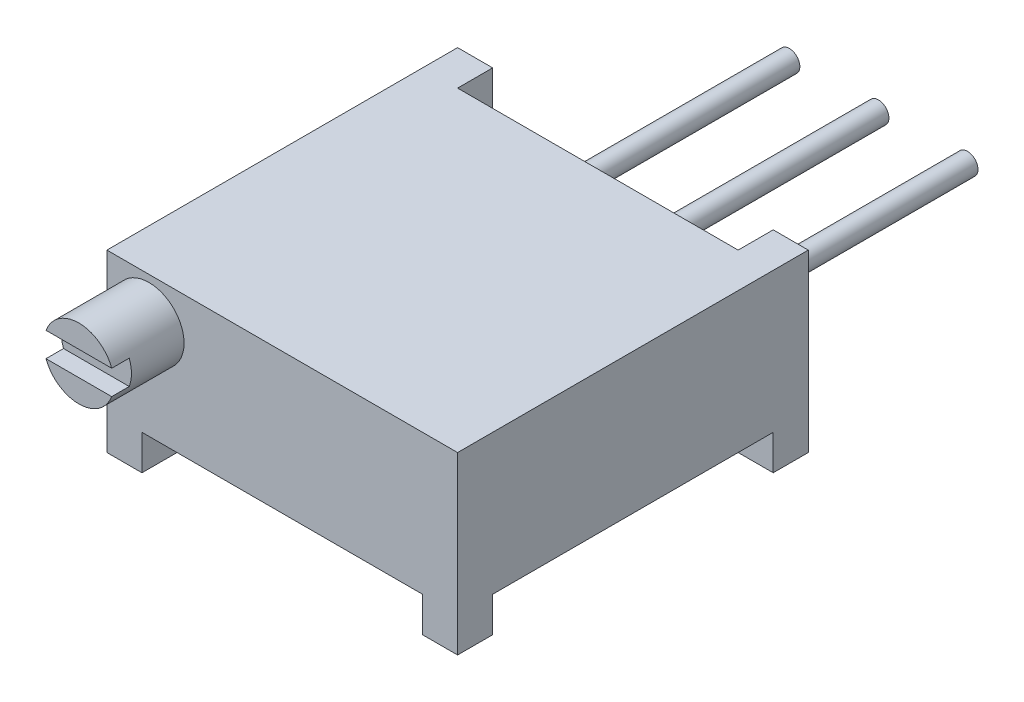
ISO-10303-21;
HEADER;
FILE_DESCRIPTION(('STEP AP214'),'2;1');
FILE_NAME('part.step','',(''),(''),'','','');
FILE_SCHEMA(('AUTOMOTIVE_DESIGN { 1 0 10303 214 1 1 1 1 }'));
ENDSEC;
DATA;
#1=APPLICATION_CONTEXT('core data for automotive mechanical design processes');
#2=APPLICATION_PROTOCOL_DEFINITION('international standard','automotive_design',2000,#1);
#3=PRODUCT_CONTEXT('',#1,'mechanical');
#4=PRODUCT('Part','Part','',(#3));
#5=PRODUCT_RELATED_PRODUCT_CATEGORY('part','',(#4));
#6=PRODUCT_DEFINITION_FORMATION('','',#4);
#7=PRODUCT_DEFINITION_CONTEXT('part definition',#1,'design');
#8=PRODUCT_DEFINITION('design','',#6,#7);
#9=PRODUCT_DEFINITION_SHAPE('','',#8);
#10=(LENGTH_UNIT() NAMED_UNIT(*) SI_UNIT(.MILLI.,.METRE.));
#11=(NAMED_UNIT(*) PLANE_ANGLE_UNIT() SI_UNIT($,.RADIAN.));
#12=(NAMED_UNIT(*) SI_UNIT($,.STERADIAN.) SOLID_ANGLE_UNIT());
#13=UNCERTAINTY_MEASURE_WITH_UNIT(LENGTH_MEASURE(1.E-05),#10,'distance_accuracy_value','');
#14=(GEOMETRIC_REPRESENTATION_CONTEXT(3) GLOBAL_UNCERTAINTY_ASSIGNED_CONTEXT((#13)) GLOBAL_UNIT_ASSIGNED_CONTEXT((#10,
#11,#12)) REPRESENTATION_CONTEXT('',''));
#15=CARTESIAN_POINT('',(0.,0.,0.));
#16=DIRECTION('',(0.,0.,1.));
#17=DIRECTION('',(1.,0.,0.));
#18=AXIS2_PLACEMENT_3D('',#15,#16,#17);
#19=CARTESIAN_POINT('',(-3.8,1.39,11.5));
#20=DIRECTION('',(0.,0.,1.));
#21=DIRECTION('',(1.,0.,0.));
#22=AXIS2_PLACEMENT_3D('',#19,#20,#21);
#23=PLANE('',#22);
#24=CARTESIAN_POINT('',(-3.8,1.39,11.5));
#25=DIRECTION('',(0.,0.,1.));
#26=DIRECTION('',(1.,0.,0.));
#27=AXIS2_PLACEMENT_3D('',#24,#25,#26);
#28=CIRCLE('',#27,1.00000000000011);
#29=CARTESIAN_POINT('',(-2.86325030024012,1.04,11.5));
#30=VERTEX_POINT('',#29);
#31=CARTESIAN_POINT('',(-2.86325030024012,1.74,11.5));
#32=VERTEX_POINT('',#31);
#33=EDGE_CURVE('E203',#30,#32,#28,.T.);
#34=ORIENTED_EDGE('',*,*,#33,.T.);
#35=DIRECTION('',(1.,0.,0.));
#36=VECTOR('',#35,1.);
#37=CARTESIAN_POINT('',(-2.86325030024012,1.74,11.5));
#38=LINE('',#37,#36);
#39=CARTESIAN_POINT('',(-4.73674969975988,1.74,11.5));
#40=VERTEX_POINT('',#39);
#41=EDGE_CURVE('E190',#40,#32,#38,.T.);
#42=ORIENTED_EDGE('',*,*,#41,.F.);
#43=CARTESIAN_POINT('',(-4.73674969975988,1.04,11.5));
#44=VERTEX_POINT('',#43);
#45=EDGE_CURVE('E196',#40,#44,#28,.T.);
#46=ORIENTED_EDGE('',*,*,#45,.T.);
#47=DIRECTION('',(1.,0.,0.));
#48=VECTOR('',#47,1.);
#49=CARTESIAN_POINT('',(-4.73674969975988,1.04,11.5));
#50=LINE('',#49,#48);
#51=EDGE_CURVE('E206',#44,#30,#50,.T.);
#52=ORIENTED_EDGE('',*,*,#51,.T.);
#53=EDGE_LOOP('',(#34,#42,#46,#52));
#54=FACE_BOUND('',#53,.T.);
#55=ADVANCED_FACE('F37',(#54),#23,.T.);
#56=CARTESIAN_POINT('',(-5.,-1.41,1.));
#57=DIRECTION('',(0.,1.,0.));
#58=DIRECTION('',(0.,0.,1.));
#59=AXIS2_PLACEMENT_3D('',#56,#57,#58);
#60=PLANE('',#59);
#61=DIRECTION('',(0.,0.,-1.));
#62=VECTOR('',#61,1.);
#63=CARTESIAN_POINT('',(4.,-1.41,9.));
#64=LINE('',#63,#62);
#65=CARTESIAN_POINT('',(4.,-1.41,10.));
#66=VERTEX_POINT('',#65);
#67=CARTESIAN_POINT('',(4.,-1.41,9.));
#68=VERTEX_POINT('',#67);
#69=EDGE_CURVE('E217',#66,#68,#64,.T.);
#70=ORIENTED_EDGE('',*,*,#69,.F.);
#71=DIRECTION('',(1.,0.,0.));
#72=VECTOR('',#71,1.);
#73=CARTESIAN_POINT('',(-5.,-1.41,10.));
#74=LINE('',#73,#72);
#75=CARTESIAN_POINT('',(-4.,-1.41,10.));
#76=VERTEX_POINT('',#75);
#77=EDGE_CURVE('E321',#76,#66,#74,.T.);
#78=ORIENTED_EDGE('',*,*,#77,.F.);
#79=DIRECTION('',(0.,0.,1.));
#80=VECTOR('',#79,1.);
#81=CARTESIAN_POINT('',(-4.,-1.41,10.));
#82=LINE('',#81,#80);
#83=CARTESIAN_POINT('',(-4.,-1.41,9.));
#84=VERTEX_POINT('',#83);
#85=EDGE_CURVE('E246',#84,#76,#82,.T.);
#86=ORIENTED_EDGE('',*,*,#85,.F.);
#87=DIRECTION('',(1.,0.,0.));
#88=VECTOR('',#87,1.);
#89=CARTESIAN_POINT('',(-4.,-1.41,9.));
#90=LINE('',#89,#88);
#91=CARTESIAN_POINT('',(-5.,-1.41,9.));
#92=VERTEX_POINT('',#91);
#93=EDGE_CURVE('E241',#92,#84,#90,.T.);
#94=ORIENTED_EDGE('',*,*,#93,.F.);
#95=DIRECTION('',(0.,0.,1.));
#96=VECTOR('',#95,1.);
#97=CARTESIAN_POINT('',(-5.,-1.41,1.));
#98=LINE('',#97,#96);
#99=CARTESIAN_POINT('',(-5.,-1.41,1.));
#100=VERTEX_POINT('',#99);
#101=EDGE_CURVE('E312',#100,#92,#98,.T.);
#102=ORIENTED_EDGE('',*,*,#101,.F.);
#103=DIRECTION('',(1.,0.,0.));
#104=VECTOR('',#103,1.);
#105=CARTESIAN_POINT('',(-5.,-1.41,1.));
#106=LINE('',#105,#104);
#107=CARTESIAN_POINT('',(-4.,-1.41,1.));
#108=VERTEX_POINT('',#107);
#109=EDGE_CURVE('E315',#100,#108,#106,.T.);
#110=ORIENTED_EDGE('',*,*,#109,.T.);
#111=DIRECTION('',(-1.,0.,0.));
#112=VECTOR('',#111,1.);
#113=CARTESIAN_POINT('',(5.,-1.41,1.));
#114=LINE('',#113,#112);
#115=CARTESIAN_POINT('',(4.,-1.41,1.));
#116=VERTEX_POINT('',#115);
#117=EDGE_CURVE('E306',#116,#108,#114,.T.);
#118=ORIENTED_EDGE('',*,*,#117,.F.);
#119=DIRECTION('',(-1.,0.,0.));
#120=VECTOR('',#119,1.);
#121=CARTESIAN_POINT('',(4.,-1.41,1.));
#122=LINE('',#121,#120);
#123=CARTESIAN_POINT('',(5.,-1.41,1.));
#124=VERTEX_POINT('',#123);
#125=EDGE_CURVE('E263',#124,#116,#122,.T.);
#126=ORIENTED_EDGE('',*,*,#125,.F.);
#127=DIRECTION('',(0.,0.,-1.));
#128=VECTOR('',#127,1.);
#129=CARTESIAN_POINT('',(5.,-1.41,1.));
#130=LINE('',#129,#128);
#131=CARTESIAN_POINT('',(5.,-1.41,9.));
#132=VERTEX_POINT('',#131);
#133=EDGE_CURVE('E300',#132,#124,#130,.T.);
#134=ORIENTED_EDGE('',*,*,#133,.F.);
#135=DIRECTION('',(1.,0.,0.));
#136=VECTOR('',#135,1.);
#137=CARTESIAN_POINT('',(5.,-1.41,9.));
#138=LINE('',#137,#136);
#139=EDGE_CURVE('E224',#68,#132,#138,.T.);
#140=ORIENTED_EDGE('',*,*,#139,.F.);
#141=EDGE_LOOP('',(#70,#78,#86,#94,#102,#110,#118,#126,#134,#140));
#142=FACE_BOUND('',#141,.T.);
#143=ADVANCED_FACE('F362',(#142),#60,.F.);
#144=CARTESIAN_POINT('',(5.,2.59,1.));
#145=DIRECTION('',(0.,0.,1.));
#146=DIRECTION('',(1.,0.,0.));
#147=AXIS2_PLACEMENT_3D('',#144,#145,#146);
#148=PLANE('',#147);
#149=CARTESIAN_POINT('',(-2.54,0.,1.));
#150=DIRECTION('',(0.,0.,1.));
#151=DIRECTION('',(1.,0.,0.));
#152=AXIS2_PLACEMENT_3D('',#149,#150,#151);
#153=CIRCLE('',#152,0.3);
#154=CARTESIAN_POINT('',(-2.24,0.,1.));
#155=VERTEX_POINT('',#154);
#156=EDGE_CURVE('E11',#155,#155,#153,.F.);
#157=ORIENTED_EDGE('',*,*,#156,.F.);
#158=EDGE_LOOP('',(#157));
#159=FACE_BOUND('',#158,.T.);
#160=CARTESIAN_POINT('',(0.,0.,1.));
#161=DIRECTION('',(0.,0.,1.));
#162=DIRECTION('',(1.,0.,0.));
#163=AXIS2_PLACEMENT_3D('',#160,#161,#162);
#164=CIRCLE('',#163,0.3);
#165=CARTESIAN_POINT('',(0.3,0.,1.));
#166=VERTEX_POINT('',#165);
#167=EDGE_CURVE('E45',#166,#166,#164,.F.);
#168=ORIENTED_EDGE('',*,*,#167,.F.);
#169=EDGE_LOOP('',(#168));
#170=FACE_BOUND('',#169,.T.);
#171=CARTESIAN_POINT('',(2.54,0.,1.));
#172=DIRECTION('',(0.,0.,1.));
#173=DIRECTION('',(1.,0.,0.));
#174=AXIS2_PLACEMENT_3D('',#171,#172,#173);
#175=CIRCLE('',#174,0.3);
#176=CARTESIAN_POINT('',(2.84,0.,1.));
#177=VERTEX_POINT('',#176);
#178=EDGE_CURVE('E347',#177,#177,#175,.F.);
#179=ORIENTED_EDGE('',*,*,#178,.F.);
#180=EDGE_LOOP('',(#179));
#181=FACE_BOUND('',#180,.T.);
#182=DIRECTION('',(0.,1.,0.));
#183=VECTOR('',#182,1.);
#184=CARTESIAN_POINT('',(4.,2.59,1.));
#185=LINE('',#184,#183);
#186=CARTESIAN_POINT('',(4.,2.59,1.));
#187=VERTEX_POINT('',#186);
#188=EDGE_CURVE('E281',#116,#187,#185,.T.);
#189=ORIENTED_EDGE('',*,*,#188,.F.);
#190=ORIENTED_EDGE('',*,*,#117,.T.);
#191=DIRECTION('',(0.,1.,0.));
#192=VECTOR('',#191,1.);
#193=CARTESIAN_POINT('',(-4.,2.59,1.));
#194=LINE('',#193,#192);
#195=CARTESIAN_POINT('',(-4.,2.59,1.));
#196=VERTEX_POINT('',#195);
#197=EDGE_CURVE('E294',#108,#196,#194,.T.);
#198=ORIENTED_EDGE('',*,*,#197,.T.);
#199=DIRECTION('',(-1.,0.,0.));
#200=VECTOR('',#199,1.);
#201=CARTESIAN_POINT('',(5.,2.59,1.));
#202=LINE('',#201,#200);
#203=EDGE_CURVE('E302',#187,#196,#202,.T.);
#204=ORIENTED_EDGE('',*,*,#203,.F.);
#205=EDGE_LOOP('',(#189,#190,#198,#204));
#206=FACE_BOUND('',#205,.T.);
#207=ADVANCED_FACE('F358',(#159,#170,#181,#206),#148,.F.);
#208=CARTESIAN_POINT('',(-4.,0.,0.));
#209=DIRECTION('',(-1.,0.,0.));
#210=DIRECTION('',(0.,0.,1.));
#211=AXIS2_PLACEMENT_3D('',#208,#209,#210);
#212=PLANE('',#211);
#213=ORIENTED_EDGE('',*,*,#197,.F.);
#214=DIRECTION('',(0.,1.,0.));
#215=VECTOR('',#214,1.);
#216=CARTESIAN_POINT('',(-4.,-2.41,1.));
#217=LINE('',#216,#215);
#218=CARTESIAN_POINT('',(-4.,-2.41,1.));
#219=VERTEX_POINT('',#218);
#220=EDGE_CURVE('E308',#219,#108,#217,.T.);
#221=ORIENTED_EDGE('',*,*,#220,.F.);
#222=DIRECTION('',(0.,0.,1.));
#223=VECTOR('',#222,1.);
#224=CARTESIAN_POINT('',(-4.,-2.41,0.));
#225=LINE('',#224,#223);
#226=CARTESIAN_POINT('',(-4.,-2.41,0.));
#227=VERTEX_POINT('',#226);
#228=EDGE_CURVE('E329',#227,#219,#225,.T.);
#229=ORIENTED_EDGE('',*,*,#228,.F.);
#230=DIRECTION('',(0.,-1.,0.));
#231=VECTOR('',#230,1.);
#232=CARTESIAN_POINT('',(-4.,2.59,0.));
#233=LINE('',#232,#231);
#234=CARTESIAN_POINT('',(-4.,2.59,0.));
#235=VERTEX_POINT('',#234);
#236=EDGE_CURVE('E326',#235,#227,#233,.T.);
#237=ORIENTED_EDGE('',*,*,#236,.F.);
#238=DIRECTION('',(0.,0.,-1.));
#239=VECTOR('',#238,1.);
#240=CARTESIAN_POINT('',(-4.,2.59,10.));
#241=LINE('',#240,#239);
#242=EDGE_CURVE('E333',#196,#235,#241,.T.);
#243=ORIENTED_EDGE('',*,*,#242,.F.);
#244=EDGE_LOOP('',(#213,#221,#229,#237,#243));
#245=FACE_BOUND('',#244,.T.);
#246=ADVANCED_FACE('F361',(#245),#212,.F.);
#247=CARTESIAN_POINT('',(-4.,2.59,0.));
#248=DIRECTION('',(0.,0.,-1.));
#249=DIRECTION('',(0.,1.,0.));
#250=AXIS2_PLACEMENT_3D('',#247,#248,#249);
#251=PLANE('',#250);
#252=DIRECTION('',(0.,-1.,0.));
#253=VECTOR('',#252,1.);
#254=CARTESIAN_POINT('',(-5.,2.59,0.));
#255=LINE('',#254,#253);
#256=CARTESIAN_POINT('',(-5.,2.59,0.));
#257=VERTEX_POINT('',#256);
#258=CARTESIAN_POINT('',(-5.,-2.41,0.));
#259=VERTEX_POINT('',#258);
#260=EDGE_CURVE('E320',#257,#259,#255,.T.);
#261=ORIENTED_EDGE('',*,*,#260,.F.);
#262=DIRECTION('',(-1.,0.,0.));
#263=VECTOR('',#262,1.);
#264=CARTESIAN_POINT('',(-4.,2.59,0.));
#265=LINE('',#264,#263);
#266=EDGE_CURVE('E345',#235,#257,#265,.T.);
#267=ORIENTED_EDGE('',*,*,#266,.F.);
#268=ORIENTED_EDGE('',*,*,#236,.T.);
#269=DIRECTION('',(-1.,0.,0.));
#270=VECTOR('',#269,1.);
#271=CARTESIAN_POINT('',(-4.,-2.41,0.));
#272=LINE('',#271,#270);
#273=EDGE_CURVE('E335',#227,#259,#272,.T.);
#274=ORIENTED_EDGE('',*,*,#273,.T.);
#275=EDGE_LOOP('',(#261,#267,#268,#274));
#276=FACE_BOUND('',#275,.T.);
#277=ADVANCED_FACE('F39',(#276),#251,.T.);
#278=CARTESIAN_POINT('',(-4.,2.59,10.));
#279=DIRECTION('',(0.,1.,0.));
#280=DIRECTION('',(0.,0.,1.));
#281=AXIS2_PLACEMENT_3D('',#278,#279,#280);
#282=PLANE('',#281);
#283=DIRECTION('',(0.,0.,-1.));
#284=VECTOR('',#283,1.);
#285=CARTESIAN_POINT('',(-5.,2.59,10.));
#286=LINE('',#285,#284);
#287=CARTESIAN_POINT('',(-5.,2.59,10.));
#288=VERTEX_POINT('',#287);
#289=EDGE_CURVE('E330',#288,#257,#286,.T.);
#290=ORIENTED_EDGE('',*,*,#289,.F.);
#291=DIRECTION('',(-1.,0.,0.));
#292=VECTOR('',#291,1.);
#293=CARTESIAN_POINT('',(-4.,2.59,10.));
#294=LINE('',#293,#292);
#295=CARTESIAN_POINT('',(5.,2.59,10.));
#296=VERTEX_POINT('',#295);
#297=EDGE_CURVE('E348',#296,#288,#294,.T.);
#298=ORIENTED_EDGE('',*,*,#297,.F.);
#299=DIRECTION('',(0.,0.,1.));
#300=VECTOR('',#299,1.);
#301=CARTESIAN_POINT('',(5.,2.59,10.));
#302=LINE('',#301,#300);
#303=CARTESIAN_POINT('',(5.,2.59,0.));
#304=VERTEX_POINT('',#303);
#305=EDGE_CURVE('E295',#304,#296,#302,.T.);
#306=ORIENTED_EDGE('',*,*,#305,.F.);
#307=DIRECTION('',(1.,0.,0.));
#308=VECTOR('',#307,1.);
#309=CARTESIAN_POINT('',(5.,2.59,0.));
#310=LINE('',#309,#308);
#311=CARTESIAN_POINT('',(4.,2.59,0.));
#312=VERTEX_POINT('',#311);
#313=EDGE_CURVE('E285',#312,#304,#310,.T.);
#314=ORIENTED_EDGE('',*,*,#313,.F.);
#315=DIRECTION('',(0.,0.,1.));
#316=VECTOR('',#315,1.);
#317=CARTESIAN_POINT('',(4.,2.59,0.));
#318=LINE('',#317,#316);
#319=EDGE_CURVE('E290',#312,#187,#318,.T.);
#320=ORIENTED_EDGE('',*,*,#319,.T.);
#321=ORIENTED_EDGE('',*,*,#203,.T.);
#322=ORIENTED_EDGE('',*,*,#242,.T.);
#323=ORIENTED_EDGE('',*,*,#266,.T.);
#324=EDGE_LOOP('',(#290,#298,#306,#314,#320,#321,#322,#323));
#325=FACE_BOUND('',#324,.T.);
#326=ADVANCED_FACE('F395',(#325),#282,.T.);
#327=CARTESIAN_POINT('',(-4.,-2.41,10.));
#328=DIRECTION('',(0.,0.,1.));
#329=DIRECTION('',(1.,0.,0.));
#330=AXIS2_PLACEMENT_3D('',#327,#328,#329);
#331=PLANE('',#330);
#332=CARTESIAN_POINT('',(-3.8,1.39,10.));
#333=DIRECTION('',(0.,0.,1.));
#334=DIRECTION('',(1.,0.,0.));
#335=AXIS2_PLACEMENT_3D('',#332,#333,#334);
#336=CIRCLE('',#335,1.);
#337=CARTESIAN_POINT('',(-2.8,1.39,10.));
#338=VERTEX_POINT('',#337);
#339=EDGE_CURVE('E212',#338,#338,#336,.T.);
#340=ORIENTED_EDGE('',*,*,#339,.F.);
#341=EDGE_LOOP('',(#340));
#342=FACE_BOUND('',#341,.T.);
#343=DIRECTION('',(0.,1.,0.));
#344=VECTOR('',#343,1.);
#345=CARTESIAN_POINT('',(-5.,-2.41,10.));
#346=LINE('',#345,#344);
#347=CARTESIAN_POINT('',(-5.,-2.41,10.));
#348=VERTEX_POINT('',#347);
#349=EDGE_CURVE('E341',#348,#288,#346,.T.);
#350=ORIENTED_EDGE('',*,*,#349,.F.);
#351=DIRECTION('',(-1.,0.,0.));
#352=VECTOR('',#351,1.);
#353=CARTESIAN_POINT('',(-5.,-2.41,10.));
#354=LINE('',#353,#352);
#355=CARTESIAN_POINT('',(-4.,-2.41,10.));
#356=VERTEX_POINT('',#355);
#357=EDGE_CURVE('E250',#356,#348,#354,.T.);
#358=ORIENTED_EDGE('',*,*,#357,.F.);
#359=DIRECTION('',(0.,1.,0.));
#360=VECTOR('',#359,1.);
#361=CARTESIAN_POINT('',(-4.,-2.41,10.));
#362=LINE('',#361,#360);
#363=EDGE_CURVE('E253',#356,#76,#362,.T.);
#364=ORIENTED_EDGE('',*,*,#363,.T.);
#365=ORIENTED_EDGE('',*,*,#77,.T.);
#366=DIRECTION('',(0.,1.,0.));
#367=VECTOR('',#366,1.);
#368=CARTESIAN_POINT('',(4.,-2.41,10.));
#369=LINE('',#368,#367);
#370=CARTESIAN_POINT('',(4.,-2.41,10.));
#371=VERTEX_POINT('',#370);
#372=EDGE_CURVE('E231',#371,#66,#369,.T.);
#373=ORIENTED_EDGE('',*,*,#372,.F.);
#374=DIRECTION('',(-1.,0.,0.));
#375=VECTOR('',#374,1.);
#376=CARTESIAN_POINT('',(4.,-2.41,10.));
#377=LINE('',#376,#375);
#378=CARTESIAN_POINT('',(5.,-2.41,10.));
#379=VERTEX_POINT('',#378);
#380=EDGE_CURVE('E229',#379,#371,#377,.T.);
#381=ORIENTED_EDGE('',*,*,#380,.F.);
#382=DIRECTION('',(0.,-1.,0.));
#383=VECTOR('',#382,1.);
#384=CARTESIAN_POINT('',(5.,-1.41,10.));
#385=LINE('',#384,#383);
#386=EDGE_CURVE('E298',#296,#379,#385,.T.);
#387=ORIENTED_EDGE('',*,*,#386,.F.);
#388=ORIENTED_EDGE('',*,*,#297,.T.);
#389=EDGE_LOOP('',(#350,#358,#364,#365,#373,#381,#387,#388));
#390=FACE_BOUND('',#389,.T.);
#391=ADVANCED_FACE('F425',(#342,#390),#331,.T.);
#392=CARTESIAN_POINT('',(-4.,-2.41,0.));
#393=DIRECTION('',(0.,-1.,0.));
#394=DIRECTION('',(0.,0.,-1.));
#395=AXIS2_PLACEMENT_3D('',#392,#393,#394);
#396=PLANE('',#395);
#397=DIRECTION('',(1.,0.,0.));
#398=VECTOR('',#397,1.);
#399=CARTESIAN_POINT('',(-5.,-2.41,1.));
#400=LINE('',#399,#398);
#401=CARTESIAN_POINT('',(-5.,-2.41,1.));
#402=VERTEX_POINT('',#401);
#403=EDGE_CURVE('E318',#402,#219,#400,.T.);
#404=ORIENTED_EDGE('',*,*,#403,.F.);
#405=DIRECTION('',(0.,0.,1.));
#406=VECTOR('',#405,1.);
#407=CARTESIAN_POINT('',(-5.,-2.41,0.));
#408=LINE('',#407,#406);
#409=EDGE_CURVE('E338',#259,#402,#408,.T.);
#410=ORIENTED_EDGE('',*,*,#409,.F.);
#411=ORIENTED_EDGE('',*,*,#273,.F.);
#412=ORIENTED_EDGE('',*,*,#228,.T.);
#413=EDGE_LOOP('',(#404,#410,#411,#412));
#414=FACE_BOUND('',#413,.T.);
#415=ADVANCED_FACE('F388',(#414),#396,.T.);
#416=CARTESIAN_POINT('',(-5.,0.,0.));
#417=DIRECTION('',(-1.,0.,0.));
#418=DIRECTION('',(0.,0.,1.));
#419=AXIS2_PLACEMENT_3D('',#416,#417,#418);
#420=PLANE('',#419);
#421=DIRECTION('',(0.,1.,0.));
#422=VECTOR('',#421,1.);
#423=CARTESIAN_POINT('',(-5.,-2.41,1.));
#424=LINE('',#423,#422);
#425=EDGE_CURVE('E309',#402,#100,#424,.T.);
#426=ORIENTED_EDGE('',*,*,#425,.T.);
#427=ORIENTED_EDGE('',*,*,#101,.T.);
#428=DIRECTION('',(0.,1.,0.));
#429=VECTOR('',#428,1.);
#430=CARTESIAN_POINT('',(-5.,-2.41,9.));
#431=LINE('',#430,#429);
#432=CARTESIAN_POINT('',(-5.,-2.41,9.));
#433=VERTEX_POINT('',#432);
#434=EDGE_CURVE('E261',#433,#92,#431,.T.);
#435=ORIENTED_EDGE('',*,*,#434,.F.);
#436=DIRECTION('',(0.,0.,-1.));
#437=VECTOR('',#436,1.);
#438=CARTESIAN_POINT('',(-5.,-2.41,9.));
#439=LINE('',#438,#437);
#440=EDGE_CURVE('E242',#348,#433,#439,.T.);
#441=ORIENTED_EDGE('',*,*,#440,.F.);
#442=ORIENTED_EDGE('',*,*,#349,.T.);
#443=ORIENTED_EDGE('',*,*,#289,.T.);
#444=ORIENTED_EDGE('',*,*,#260,.T.);
#445=ORIENTED_EDGE('',*,*,#409,.T.);
#446=EDGE_LOOP('',(#426,#427,#435,#441,#442,#443,#444,#445));
#447=FACE_BOUND('',#446,.T.);
#448=ADVANCED_FACE('F439',(#447),#420,.T.);
#449=CARTESIAN_POINT('',(-5.,-2.41,1.));
#450=DIRECTION('',(0.,0.,-1.));
#451=DIRECTION('',(0.,1.,0.));
#452=AXIS2_PLACEMENT_3D('',#449,#450,#451);
#453=PLANE('',#452);
#454=ORIENTED_EDGE('',*,*,#220,.T.);
#455=ORIENTED_EDGE('',*,*,#109,.F.);
#456=ORIENTED_EDGE('',*,*,#425,.F.);
#457=ORIENTED_EDGE('',*,*,#403,.T.);
#458=EDGE_LOOP('',(#454,#455,#456,#457));
#459=FACE_BOUND('',#458,.T.);
#460=ADVANCED_FACE('F381',(#459),#453,.F.);
#461=CARTESIAN_POINT('',(5.,0.,0.));
#462=DIRECTION('',(-1.,0.,0.));
#463=DIRECTION('',(0.,0.,1.));
#464=AXIS2_PLACEMENT_3D('',#461,#462,#463);
#465=PLANE('',#464);
#466=ORIENTED_EDGE('',*,*,#305,.T.);
#467=ORIENTED_EDGE('',*,*,#386,.T.);
#468=DIRECTION('',(0.,0.,1.));
#469=VECTOR('',#468,1.);
#470=CARTESIAN_POINT('',(5.,-2.41,10.));
#471=LINE('',#470,#469);
#472=CARTESIAN_POINT('',(5.,-2.41,9.));
#473=VERTEX_POINT('',#472);
#474=EDGE_CURVE('E226',#473,#379,#471,.T.);
#475=ORIENTED_EDGE('',*,*,#474,.F.);
#476=DIRECTION('',(0.,1.,0.));
#477=VECTOR('',#476,1.);
#478=CARTESIAN_POINT('',(5.,-2.41,9.));
#479=LINE('',#478,#477);
#480=EDGE_CURVE('E237',#473,#132,#479,.T.);
#481=ORIENTED_EDGE('',*,*,#480,.T.);
#482=ORIENTED_EDGE('',*,*,#133,.T.);
#483=DIRECTION('',(0.,1.,0.));
#484=VECTOR('',#483,1.);
#485=CARTESIAN_POINT('',(5.,-2.41,1.));
#486=LINE('',#485,#484);
#487=CARTESIAN_POINT('',(5.,-2.41,1.));
#488=VERTEX_POINT('',#487);
#489=EDGE_CURVE('E278',#488,#124,#486,.T.);
#490=ORIENTED_EDGE('',*,*,#489,.F.);
#491=DIRECTION('',(0.,0.,1.));
#492=VECTOR('',#491,1.);
#493=CARTESIAN_POINT('',(5.,-2.41,1.));
#494=LINE('',#493,#492);
#495=CARTESIAN_POINT('',(5.,-2.41,0.));
#496=VERTEX_POINT('',#495);
#497=EDGE_CURVE('E270',#496,#488,#494,.T.);
#498=ORIENTED_EDGE('',*,*,#497,.F.);
#499=DIRECTION('',(0.,-1.,0.));
#500=VECTOR('',#499,1.);
#501=CARTESIAN_POINT('',(5.,-1.41,0.));
#502=LINE('',#501,#500);
#503=EDGE_CURVE('E288',#304,#496,#502,.T.);
#504=ORIENTED_EDGE('',*,*,#503,.F.);
#505=EDGE_LOOP('',(#466,#467,#475,#481,#482,#490,#498,#504));
#506=FACE_BOUND('',#505,.T.);
#507=ADVANCED_FACE('F411',(#506),#465,.F.);
#508=CARTESIAN_POINT('',(4.,2.59,0.));
#509=DIRECTION('',(1.,0.,0.));
#510=DIRECTION('',(0.,0.,-1.));
#511=AXIS2_PLACEMENT_3D('',#508,#509,#510);
#512=PLANE('',#511);
#513=ORIENTED_EDGE('',*,*,#188,.T.);
#514=ORIENTED_EDGE('',*,*,#319,.F.);
#515=DIRECTION('',(0.,1.,0.));
#516=VECTOR('',#515,1.);
#517=CARTESIAN_POINT('',(4.,2.59,0.));
#518=LINE('',#517,#516);
#519=CARTESIAN_POINT('',(4.,-2.41,0.));
#520=VERTEX_POINT('',#519);
#521=EDGE_CURVE('E282',#520,#312,#518,.T.);
#522=ORIENTED_EDGE('',*,*,#521,.F.);
#523=DIRECTION('',(0.,0.,-1.));
#524=VECTOR('',#523,1.);
#525=CARTESIAN_POINT('',(4.,-2.41,0.));
#526=LINE('',#525,#524);
#527=CARTESIAN_POINT('',(4.,-2.41,1.));
#528=VERTEX_POINT('',#527);
#529=EDGE_CURVE('E264',#528,#520,#526,.T.);
#530=ORIENTED_EDGE('',*,*,#529,.F.);
#531=DIRECTION('',(0.,1.,0.));
#532=VECTOR('',#531,1.);
#533=CARTESIAN_POINT('',(4.,-2.41,1.));
#534=LINE('',#533,#532);
#535=EDGE_CURVE('E274',#528,#116,#534,.T.);
#536=ORIENTED_EDGE('',*,*,#535,.T.);
#537=EDGE_LOOP('',(#513,#514,#522,#530,#536));
#538=FACE_BOUND('',#537,.T.);
#539=ADVANCED_FACE('F396',(#538),#512,.F.);
#540=CARTESIAN_POINT('',(0.,0.,0.));
#541=DIRECTION('',(0.,0.,1.));
#542=DIRECTION('',(1.,0.,0.));
#543=AXIS2_PLACEMENT_3D('',#540,#541,#542);
#544=PLANE('',#543);
#545=ORIENTED_EDGE('',*,*,#521,.T.);
#546=ORIENTED_EDGE('',*,*,#313,.T.);
#547=ORIENTED_EDGE('',*,*,#503,.T.);
#548=DIRECTION('',(1.,0.,0.));
#549=VECTOR('',#548,1.);
#550=CARTESIAN_POINT('',(5.,-2.41,0.));
#551=LINE('',#550,#549);
#552=EDGE_CURVE('E267',#520,#496,#551,.T.);
#553=ORIENTED_EDGE('',*,*,#552,.F.);
#554=EDGE_LOOP('',(#545,#546,#547,#553));
#555=FACE_BOUND('',#554,.T.);
#556=ADVANCED_FACE('F400',(#555),#544,.F.);
#557=CARTESIAN_POINT('',(4.,-2.41,1.));
#558=DIRECTION('',(0.,0.,-1.));
#559=DIRECTION('',(-1.,0.,0.));
#560=AXIS2_PLACEMENT_3D('',#557,#558,#559);
#561=PLANE('',#560);
#562=ORIENTED_EDGE('',*,*,#125,.T.);
#563=ORIENTED_EDGE('',*,*,#535,.F.);
#564=DIRECTION('',(-1.,0.,0.));
#565=VECTOR('',#564,1.);
#566=CARTESIAN_POINT('',(4.,-2.41,1.));
#567=LINE('',#566,#565);
#568=EDGE_CURVE('E272',#488,#528,#567,.T.);
#569=ORIENTED_EDGE('',*,*,#568,.F.);
#570=ORIENTED_EDGE('',*,*,#489,.T.);
#571=EDGE_LOOP('',(#562,#563,#569,#570));
#572=FACE_BOUND('',#571,.T.);
#573=ADVANCED_FACE('F409',(#572),#561,.F.);
#574=CARTESIAN_POINT('',(0.,-2.41,0.));
#575=DIRECTION('',(0.,1.,0.));
#576=DIRECTION('',(0.,0.,1.));
#577=AXIS2_PLACEMENT_3D('',#574,#575,#576);
#578=PLANE('',#577);
#579=ORIENTED_EDGE('',*,*,#529,.T.);
#580=ORIENTED_EDGE('',*,*,#552,.T.);
#581=ORIENTED_EDGE('',*,*,#497,.T.);
#582=ORIENTED_EDGE('',*,*,#568,.T.);
#583=EDGE_LOOP('',(#579,#580,#581,#582));
#584=FACE_BOUND('',#583,.T.);
#585=ADVANCED_FACE('F404',(#584),#578,.F.);
#586=CARTESIAN_POINT('',(-4.,-2.41,9.));
#587=DIRECTION('',(0.,0.,1.));
#588=DIRECTION('',(1.,0.,0.));
#589=AXIS2_PLACEMENT_3D('',#586,#587,#588);
#590=PLANE('',#589);
#591=ORIENTED_EDGE('',*,*,#93,.T.);
#592=DIRECTION('',(0.,1.,0.));
#593=VECTOR('',#592,1.);
#594=CARTESIAN_POINT('',(-4.,-2.41,9.));
#595=LINE('',#594,#593);
#596=CARTESIAN_POINT('',(-4.,-2.41,9.));
#597=VERTEX_POINT('',#596);
#598=EDGE_CURVE('E258',#597,#84,#595,.T.);
#599=ORIENTED_EDGE('',*,*,#598,.F.);
#600=DIRECTION('',(1.,0.,0.));
#601=VECTOR('',#600,1.);
#602=CARTESIAN_POINT('',(-4.,-2.41,9.));
#603=LINE('',#602,#601);
#604=EDGE_CURVE('E245',#433,#597,#603,.T.);
#605=ORIENTED_EDGE('',*,*,#604,.F.);
#606=ORIENTED_EDGE('',*,*,#434,.T.);
#607=EDGE_LOOP('',(#591,#599,#605,#606));
#608=FACE_BOUND('',#607,.T.);
#609=ADVANCED_FACE('F435',(#608),#590,.F.);
#610=CARTESIAN_POINT('',(-4.,-2.41,10.));
#611=DIRECTION('',(-1.,0.,0.));
#612=DIRECTION('',(0.,0.,1.));
#613=AXIS2_PLACEMENT_3D('',#610,#611,#612);
#614=PLANE('',#613);
#615=ORIENTED_EDGE('',*,*,#85,.T.);
#616=ORIENTED_EDGE('',*,*,#363,.F.);
#617=DIRECTION('',(0.,0.,1.));
#618=VECTOR('',#617,1.);
#619=CARTESIAN_POINT('',(-4.,-2.41,10.));
#620=LINE('',#619,#618);
#621=EDGE_CURVE('E248',#597,#356,#620,.T.);
#622=ORIENTED_EDGE('',*,*,#621,.F.);
#623=ORIENTED_EDGE('',*,*,#598,.T.);
#624=EDGE_LOOP('',(#615,#616,#622,#623));
#625=FACE_BOUND('',#624,.T.);
#626=ADVANCED_FACE('F431',(#625),#614,.F.);
#627=CARTESIAN_POINT('',(0.,-2.41,0.));
#628=DIRECTION('',(0.,1.,0.));
#629=DIRECTION('',(0.,0.,1.));
#630=AXIS2_PLACEMENT_3D('',#627,#628,#629);
#631=PLANE('',#630);
#632=ORIENTED_EDGE('',*,*,#440,.T.);
#633=ORIENTED_EDGE('',*,*,#604,.T.);
#634=ORIENTED_EDGE('',*,*,#621,.T.);
#635=ORIENTED_EDGE('',*,*,#357,.T.);
#636=EDGE_LOOP('',(#632,#633,#634,#635));
#637=FACE_BOUND('',#636,.T.);
#638=ADVANCED_FACE('F684',(#637),#631,.F.);
#639=CARTESIAN_POINT('',(4.,-2.41,9.));
#640=DIRECTION('',(1.,0.,0.));
#641=DIRECTION('',(0.,0.,-1.));
#642=AXIS2_PLACEMENT_3D('',#639,#640,#641);
#643=PLANE('',#642);
#644=ORIENTED_EDGE('',*,*,#69,.T.);
#645=DIRECTION('',(0.,1.,0.));
#646=VECTOR('',#645,1.);
#647=CARTESIAN_POINT('',(4.,-2.41,9.));
#648=LINE('',#647,#646);
#649=CARTESIAN_POINT('',(4.,-2.41,9.));
#650=VERTEX_POINT('',#649);
#651=EDGE_CURVE('E239',#650,#68,#648,.T.);
#652=ORIENTED_EDGE('',*,*,#651,.F.);
#653=DIRECTION('',(0.,0.,-1.));
#654=VECTOR('',#653,1.);
#655=CARTESIAN_POINT('',(4.,-2.41,9.));
#656=LINE('',#655,#654);
#657=EDGE_CURVE('E220',#371,#650,#656,.T.);
#658=ORIENTED_EDGE('',*,*,#657,.F.);
#659=ORIENTED_EDGE('',*,*,#372,.T.);
#660=EDGE_LOOP('',(#644,#652,#658,#659));
#661=FACE_BOUND('',#660,.T.);
#662=ADVANCED_FACE('F421',(#661),#643,.F.);
#663=CARTESIAN_POINT('',(5.,-2.41,9.));
#664=DIRECTION('',(0.,0.,1.));
#665=DIRECTION('',(1.,0.,0.));
#666=AXIS2_PLACEMENT_3D('',#663,#664,#665);
#667=PLANE('',#666);
#668=ORIENTED_EDGE('',*,*,#139,.T.);
#669=ORIENTED_EDGE('',*,*,#480,.F.);
#670=DIRECTION('',(1.,0.,0.));
#671=VECTOR('',#670,1.);
#672=CARTESIAN_POINT('',(5.,-2.41,9.));
#673=LINE('',#672,#671);
#674=EDGE_CURVE('E223',#650,#473,#673,.T.);
#675=ORIENTED_EDGE('',*,*,#674,.F.);
#676=ORIENTED_EDGE('',*,*,#651,.T.);
#677=EDGE_LOOP('',(#668,#669,#675,#676));
#678=FACE_BOUND('',#677,.T.);
#679=ADVANCED_FACE('F417',(#678),#667,.F.);
#680=CARTESIAN_POINT('',(0.,-2.41,0.));
#681=DIRECTION('',(0.,1.,0.));
#682=DIRECTION('',(0.,0.,1.));
#683=AXIS2_PLACEMENT_3D('',#680,#681,#682);
#684=PLANE('',#683);
#685=ORIENTED_EDGE('',*,*,#657,.T.);
#686=ORIENTED_EDGE('',*,*,#674,.T.);
#687=ORIENTED_EDGE('',*,*,#474,.T.);
#688=ORIENTED_EDGE('',*,*,#380,.T.);
#689=EDGE_LOOP('',(#685,#686,#687,#688));
#690=FACE_BOUND('',#689,.T.);
#691=ADVANCED_FACE('F441',(#690),#684,.F.);
#692=CARTESIAN_POINT('',(-3.8,1.39,12.));
#693=DIRECTION('',(0.,0.,-1.));
#694=DIRECTION('',(-1.,0.,0.));
#695=AXIS2_PLACEMENT_3D('',#692,#693,#694);
#696=CYLINDRICAL_SURFACE('',#695,1.);
#697=CARTESIAN_POINT('',(-3.8,1.39,12.));
#698=DIRECTION('',(0.,0.,1.));
#699=DIRECTION('',(1.,0.,0.));
#700=AXIS2_PLACEMENT_3D('',#697,#698,#699);
#701=CIRCLE('',#700,1.);
#702=CARTESIAN_POINT('',(-4.73674969975976,1.04,12.));
#703=VERTEX_POINT('',#702);
#704=CARTESIAN_POINT('',(-2.86325030024012,1.04,12.));
#705=VERTEX_POINT('',#704);
#706=EDGE_CURVE('E214',#703,#705,#701,.T.);
#707=ORIENTED_EDGE('',*,*,#706,.F.);
#708=DIRECTION('',(0.,0.,1.));
#709=VECTOR('',#708,1.);
#710=CARTESIAN_POINT('',(-4.73674969975988,1.04,11.5));
#711=LINE('',#710,#709);
#712=EDGE_CURVE('E60',#44,#703,#711,.T.);
#713=ORIENTED_EDGE('',*,*,#712,.F.);
#714=ORIENTED_EDGE('',*,*,#45,.F.);
#715=DIRECTION('',(0.,0.,-1.));
#716=VECTOR('',#715,1.);
#717=CARTESIAN_POINT('',(-4.73674969975988,1.74,12.));
#718=LINE('',#717,#716);
#719=CARTESIAN_POINT('',(-4.73674969975988,1.74,12.));
#720=VERTEX_POINT('',#719);
#721=EDGE_CURVE('E52',#720,#40,#718,.T.);
#722=ORIENTED_EDGE('',*,*,#721,.F.);
#723=CARTESIAN_POINT('',(-3.8,1.39,12.));
#724=DIRECTION('',(0.,0.,1.));
#725=DIRECTION('',(-1.,0.,0.));
#726=AXIS2_PLACEMENT_3D('',#723,#724,#725);
#727=CIRCLE('',#726,1.00000000000011);
#728=CARTESIAN_POINT('',(-2.86325030024012,1.74,12.));
#729=VERTEX_POINT('',#728);
#730=EDGE_CURVE('E186',#729,#720,#727,.T.);
#731=ORIENTED_EDGE('',*,*,#730,.F.);
#732=DIRECTION('',(0.,0.,-1.));
#733=VECTOR('',#732,1.);
#734=CARTESIAN_POINT('',(-2.86325030024012,1.74,12.));
#735=LINE('',#734,#733);
#736=EDGE_CURVE('E183',#729,#32,#735,.T.);
#737=ORIENTED_EDGE('',*,*,#736,.T.);
#738=ORIENTED_EDGE('',*,*,#33,.F.);
#739=DIRECTION('',(0.,0.,1.));
#740=VECTOR('',#739,1.);
#741=CARTESIAN_POINT('',(-2.86325030024012,1.04,11.5));
#742=LINE('',#741,#740);
#743=EDGE_CURVE('E209',#30,#705,#742,.T.);
#744=ORIENTED_EDGE('',*,*,#743,.T.);
#745=EDGE_LOOP('',(#707,#713,#714,#722,#731,#737,#738,#744));
#746=FACE_BOUND('',#745,.T.);
#747=ORIENTED_EDGE('',*,*,#339,.T.);
#748=EDGE_LOOP('',(#747));
#749=FACE_BOUND('',#748,.T.);
#750=ADVANCED_FACE('F194',(#746,#749),#696,.T.);
#751=CARTESIAN_POINT('',(-3.8,1.39,12.));
#752=DIRECTION('',(0.,0.,1.));
#753=DIRECTION('',(1.,0.,0.));
#754=AXIS2_PLACEMENT_3D('',#751,#752,#753);
#755=PLANE('',#754);
#756=DIRECTION('',(1.,0.,0.));
#757=VECTOR('',#756,1.);
#758=CARTESIAN_POINT('',(-4.73674969975988,1.04,12.));
#759=LINE('',#758,#757);
#760=EDGE_CURVE('E197',#703,#705,#759,.T.);
#761=ORIENTED_EDGE('',*,*,#760,.F.);
#762=ORIENTED_EDGE('',*,*,#706,.T.);
#763=EDGE_LOOP('',(#761,#762));
#764=FACE_BOUND('',#763,.T.);
#765=ADVANCED_FACE('F448',(#764),#755,.T.);
#766=CARTESIAN_POINT('',(-4.73674969975988,1.04,11.5));
#767=DIRECTION('',(0.,-1.,0.));
#768=DIRECTION('',(0.,0.,-1.));
#769=AXIS2_PLACEMENT_3D('',#766,#767,#768);
#770=PLANE('',#769);
#771=ORIENTED_EDGE('',*,*,#760,.T.);
#772=ORIENTED_EDGE('',*,*,#743,.F.);
#773=ORIENTED_EDGE('',*,*,#51,.F.);
#774=ORIENTED_EDGE('',*,*,#712,.T.);
#775=EDGE_LOOP('',(#771,#772,#773,#774));
#776=FACE_BOUND('',#775,.T.);
#777=ADVANCED_FACE('F461',(#776),#770,.F.);
#778=CARTESIAN_POINT('',(-2.86325030024012,1.74,12.));
#779=DIRECTION('',(0.,1.,0.));
#780=DIRECTION('',(0.,0.,1.));
#781=AXIS2_PLACEMENT_3D('',#778,#779,#780);
#782=PLANE('',#781);
#783=ORIENTED_EDGE('',*,*,#41,.T.);
#784=ORIENTED_EDGE('',*,*,#736,.F.);
#785=DIRECTION('',(1.,0.,0.));
#786=VECTOR('',#785,1.);
#787=CARTESIAN_POINT('',(-2.86325030024012,1.74,12.));
#788=LINE('',#787,#786);
#789=EDGE_CURVE('E179',#720,#729,#788,.T.);
#790=ORIENTED_EDGE('',*,*,#789,.F.);
#791=ORIENTED_EDGE('',*,*,#721,.T.);
#792=EDGE_LOOP('',(#783,#784,#790,#791));
#793=FACE_BOUND('',#792,.T.);
#794=ADVANCED_FACE('F181',(#793),#782,.F.);
#795=CARTESIAN_POINT('',(-3.8,1.39,12.));
#796=DIRECTION('',(0.,0.,-1.));
#797=DIRECTION('',(-1.,0.,0.));
#798=AXIS2_PLACEMENT_3D('',#795,#796,#797);
#799=PLANE('',#798);
#800=ORIENTED_EDGE('',*,*,#730,.T.);
#801=ORIENTED_EDGE('',*,*,#789,.T.);
#802=EDGE_LOOP('',(#800,#801));
#803=FACE_BOUND('',#802,.T.);
#804=ADVANCED_FACE('F188',(#803),#799,.F.);
#805=CARTESIAN_POINT('',(2.54,0.,-7.));
#806=DIRECTION('',(0.,0.,1.));
#807=DIRECTION('',(1.,0.,0.));
#808=AXIS2_PLACEMENT_3D('',#805,#806,#807);
#809=CYLINDRICAL_SURFACE('',#808,0.3);
#810=CARTESIAN_POINT('',(2.54,0.,-7.));
#811=DIRECTION('',(0.,0.,-1.));
#812=DIRECTION('',(-1.,0.,0.));
#813=AXIS2_PLACEMENT_3D('',#810,#811,#812);
#814=CIRCLE('',#813,0.3);
#815=CARTESIAN_POINT('',(2.24,0.,-7.));
#816=VERTEX_POINT('',#815);
#817=EDGE_CURVE('E469',#816,#816,#814,.T.);
#818=ORIENTED_EDGE('',*,*,#817,.F.);
#819=EDGE_LOOP('',(#818));
#820=FACE_BOUND('',#819,.T.);
#821=ORIENTED_EDGE('',*,*,#178,.T.);
#822=EDGE_LOOP('',(#821));
#823=FACE_BOUND('',#822,.T.);
#824=ADVANCED_FACE('F502',(#820,#823),#809,.T.);
#825=CARTESIAN_POINT('',(2.54,0.,-7.));
#826=DIRECTION('',(0.,0.,-1.));
#827=DIRECTION('',(-1.,0.,0.));
#828=AXIS2_PLACEMENT_3D('',#825,#826,#827);
#829=PLANE('',#828);
#830=ORIENTED_EDGE('',*,*,#817,.T.);
#831=EDGE_LOOP('',(#830));
#832=FACE_BOUND('',#831,.T.);
#833=ADVANCED_FACE('F498',(#832),#829,.T.);
#834=CARTESIAN_POINT('',(0.,0.,-7.));
#835=DIRECTION('',(0.,0.,1.));
#836=DIRECTION('',(1.,0.,0.));
#837=AXIS2_PLACEMENT_3D('',#834,#835,#836);
#838=CYLINDRICAL_SURFACE('',#837,0.3);
#839=CARTESIAN_POINT('',(0.,0.,-7.));
#840=DIRECTION('',(0.,0.,-1.));
#841=DIRECTION('',(-1.,0.,0.));
#842=AXIS2_PLACEMENT_3D('',#839,#840,#841);
#843=CIRCLE('',#842,0.3);
#844=CARTESIAN_POINT('',(-0.3,0.,-7.));
#845=VERTEX_POINT('',#844);
#846=EDGE_CURVE('E471',#845,#845,#843,.T.);
#847=ORIENTED_EDGE('',*,*,#846,.F.);
#848=EDGE_LOOP('',(#847));
#849=FACE_BOUND('',#848,.T.);
#850=ORIENTED_EDGE('',*,*,#167,.T.);
#851=EDGE_LOOP('',(#850));
#852=FACE_BOUND('',#851,.T.);
#853=ADVANCED_FACE('F356',(#849,#852),#838,.T.);
#854=CARTESIAN_POINT('',(0.,0.,-7.));
#855=DIRECTION('',(0.,0.,-1.));
#856=DIRECTION('',(-1.,0.,0.));
#857=AXIS2_PLACEMENT_3D('',#854,#855,#856);
#858=PLANE('',#857);
#859=ORIENTED_EDGE('',*,*,#846,.T.);
#860=EDGE_LOOP('',(#859));
#861=FACE_BOUND('',#860,.T.);
#862=ADVANCED_FACE('F485',(#861),#858,.T.);
#863=CARTESIAN_POINT('',(-2.54,0.,-7.));
#864=DIRECTION('',(0.,0.,1.));
#865=DIRECTION('',(1.,0.,0.));
#866=AXIS2_PLACEMENT_3D('',#863,#864,#865);
#867=CYLINDRICAL_SURFACE('',#866,0.3);
#868=CARTESIAN_POINT('',(-2.54,0.,-7.));
#869=DIRECTION('',(0.,0.,-1.));
#870=DIRECTION('',(-1.,0.,0.));
#871=AXIS2_PLACEMENT_3D('',#868,#869,#870);
#872=CIRCLE('',#871,0.3);
#873=CARTESIAN_POINT('',(-2.84,0.,-7.));
#874=VERTEX_POINT('',#873);
#875=EDGE_CURVE('E476',#874,#874,#872,.T.);
#876=ORIENTED_EDGE('',*,*,#875,.F.);
#877=EDGE_LOOP('',(#876));
#878=FACE_BOUND('',#877,.T.);
#879=ORIENTED_EDGE('',*,*,#156,.T.);
#880=EDGE_LOOP('',(#879));
#881=FACE_BOUND('',#880,.T.);
#882=ADVANCED_FACE('F482',(#878,#881),#867,.T.);
#883=CARTESIAN_POINT('',(-2.54,0.,-7.));
#884=DIRECTION('',(0.,0.,-1.));
#885=DIRECTION('',(-1.,0.,0.));
#886=AXIS2_PLACEMENT_3D('',#883,#884,#885);
#887=PLANE('',#886);
#888=ORIENTED_EDGE('',*,*,#875,.T.);
#889=EDGE_LOOP('',(#888));
#890=FACE_BOUND('',#889,.T.);
#891=ADVANCED_FACE('F480',(#890),#887,.T.);
#892=CLOSED_SHELL('',(#55,#143,#207,#246,#277,#326,#391,#415,#448,#460,#507,#539,#556,#573,#585,
#609,#626,#638,#662,#679,#691,#750,#765,#777,#794,#804,#824,#833,#853,#862,#882,#891));
#893=MANIFOLD_SOLID_BREP('B2',#892);
#894=ADVANCED_BREP_SHAPE_REPRESENTATION('',(#18,#893),#14);
#895=SHAPE_DEFINITION_REPRESENTATION(#9,#894);
ENDSEC;
END-ISO-10303-21;
